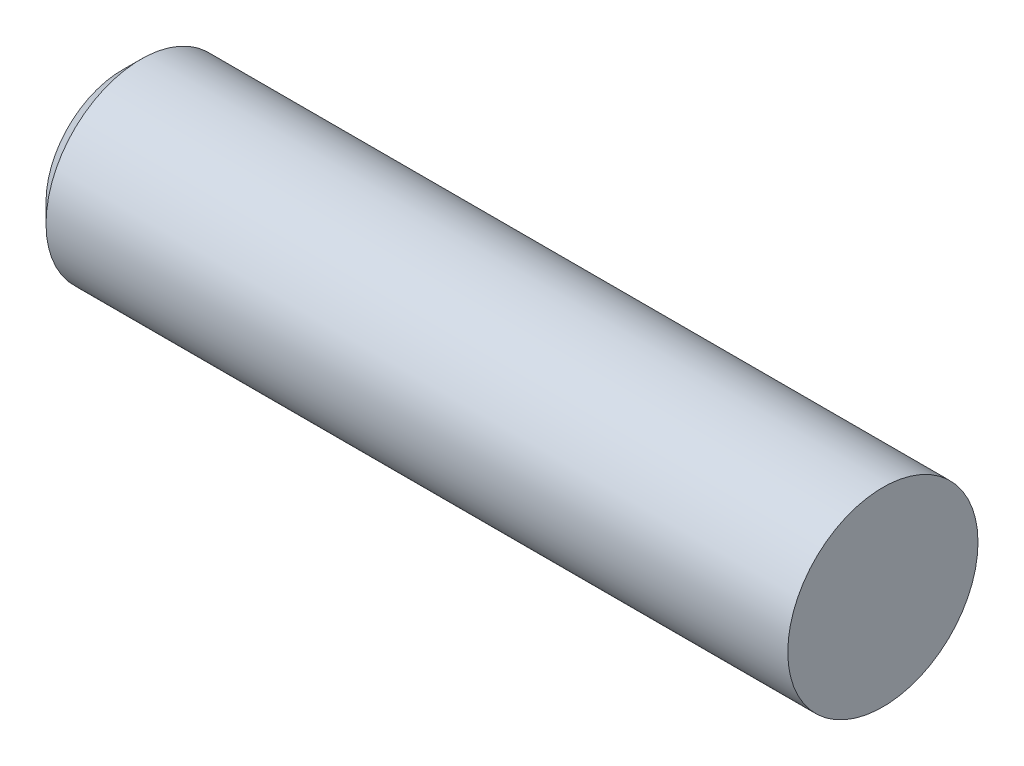
ISO-10303-21;
HEADER;
FILE_DESCRIPTION(('STEP AP214'),'2;1');
FILE_NAME('part.step','',(''),(''),'','','');
FILE_SCHEMA(('AUTOMOTIVE_DESIGN { 1 0 10303 214 1 1 1 1 }'));
ENDSEC;
DATA;
#1=APPLICATION_CONTEXT('core data for automotive mechanical design processes');
#2=APPLICATION_PROTOCOL_DEFINITION('international standard','automotive_design',2000,#1);
#3=PRODUCT_CONTEXT('',#1,'mechanical');
#4=PRODUCT('Part','Part','',(#3));
#5=PRODUCT_RELATED_PRODUCT_CATEGORY('part','',(#4));
#6=PRODUCT_DEFINITION_FORMATION('','',#4);
#7=PRODUCT_DEFINITION_CONTEXT('part definition',#1,'design');
#8=PRODUCT_DEFINITION('design','',#6,#7);
#9=PRODUCT_DEFINITION_SHAPE('','',#8);
#10=(LENGTH_UNIT() NAMED_UNIT(*) SI_UNIT(.MILLI.,.METRE.));
#11=(NAMED_UNIT(*) PLANE_ANGLE_UNIT() SI_UNIT($,.RADIAN.));
#12=(NAMED_UNIT(*) SI_UNIT($,.STERADIAN.) SOLID_ANGLE_UNIT());
#13=UNCERTAINTY_MEASURE_WITH_UNIT(LENGTH_MEASURE(1.E-05),#10,'distance_accuracy_value','');
#14=(GEOMETRIC_REPRESENTATION_CONTEXT(3) GLOBAL_UNCERTAINTY_ASSIGNED_CONTEXT((#13)) GLOBAL_UNIT_ASSIGNED_CONTEXT((#10,
#11,#12)) REPRESENTATION_CONTEXT('',''));
#15=CARTESIAN_POINT('',(0.,0.,0.));
#16=DIRECTION('',(0.,0.,1.));
#17=DIRECTION('',(1.,0.,0.));
#18=AXIS2_PLACEMENT_3D('',#15,#16,#17);
#19=CARTESIAN_POINT('',(-4.7625,0.,0.));
#20=DIRECTION('',(1.,0.,0.));
#21=DIRECTION('',(0.,0.,1.));
#22=AXIS2_PLACEMENT_3D('',#19,#20,#21);
#23=CYLINDRICAL_SURFACE('',#22,1.190625);
#24=CARTESIAN_POINT('',(4.7625,0.,0.));
#25=DIRECTION('',(-1.,0.,0.));
#26=DIRECTION('',(0.,0.,1.));
#27=AXIS2_PLACEMENT_3D('',#24,#25,#26);
#28=CIRCLE('',#27,1.190625);
#29=CARTESIAN_POINT('',(4.7625,0.,1.190625));
#30=VERTEX_POINT('',#29);
#31=EDGE_CURVE('E38',#30,#30,#28,.T.);
#32=ORIENTED_EDGE('',*,*,#31,.T.);
#33=EDGE_LOOP('',(#32));
#34=FACE_BOUND('',#33,.T.);
#35=CARTESIAN_POINT('',(-4.524375,0.,0.));
#36=DIRECTION('',(-1.,0.,0.));
#37=DIRECTION('',(0.,0.,1.));
#38=AXIS2_PLACEMENT_3D('',#35,#36,#37);
#39=CIRCLE('',#38,1.190625);
#40=CARTESIAN_POINT('',(-4.524375,0.,1.190625));
#41=VERTEX_POINT('',#40);
#42=EDGE_CURVE('E42',#41,#41,#39,.T.);
#43=ORIENTED_EDGE('',*,*,#42,.F.);
#44=EDGE_LOOP('',(#43));
#45=FACE_BOUND('',#44,.T.);
#46=ADVANCED_FACE('F35',(#34,#45),#23,.T.);
#47=CARTESIAN_POINT('',(-4.7625,0.,0.));
#48=DIRECTION('',(1.,0.,0.));
#49=DIRECTION('',(0.,0.,1.));
#50=AXIS2_PLACEMENT_3D('',#47,#48,#49);
#51=PLANE('',#50);
#52=CARTESIAN_POINT('',(-4.7625,0.,0.));
#53=DIRECTION('',(-1.,0.,0.));
#54=DIRECTION('',(0.,0.,1.));
#55=AXIS2_PLACEMENT_3D('',#52,#53,#54);
#56=CIRCLE('',#55,0.952499999999998);
#57=CARTESIAN_POINT('',(-4.7625,0.,0.952499999999999));
#58=VERTEX_POINT('',#57);
#59=EDGE_CURVE('E10',#58,#58,#56,.F.);
#60=ORIENTED_EDGE('',*,*,#59,.F.);
#61=EDGE_LOOP('',(#60));
#62=FACE_BOUND('',#61,.T.);
#63=ADVANCED_FACE('F57',(#62),#51,.F.);
#64=CARTESIAN_POINT('',(4.7625,0.,0.));
#65=DIRECTION('',(1.,0.,0.));
#66=DIRECTION('',(0.,0.,1.));
#67=AXIS2_PLACEMENT_3D('',#64,#65,#66);
#68=PLANE('',#67);
#69=ORIENTED_EDGE('',*,*,#31,.F.);
#70=EDGE_LOOP('',(#69));
#71=FACE_BOUND('',#70,.T.);
#72=ADVANCED_FACE('F54',(#71),#68,.T.);
#73=CARTESIAN_POINT('',(-4.524375,0.,0.));
#74=DIRECTION('',(1.,0.,0.));
#75=DIRECTION('',(0.,0.,1.));
#76=AXIS2_PLACEMENT_3D('',#73,#74,#75);
#77=CONICAL_SURFACE('',#76,1.190625,0.78539816339745);
#78=CARTESIAN_POINT('',(-4.7625,0.,0.952499999999999));
#79=CARTESIAN_POINT('',(-4.76001953125,0.,0.954980468749999));
#80=CARTESIAN_POINT('',(-4.7575390625,0.,0.957460937499999));
#81=CARTESIAN_POINT('',(-4.752578125,0.,0.962421874999999));
#82=CARTESIAN_POINT('',(-4.75009765625,0.,0.964902343749999));
#83=CARTESIAN_POINT('',(-4.74513671875,0.,0.969863281249999));
#84=CARTESIAN_POINT('',(-4.74265625,0.,0.972343749999999));
#85=CARTESIAN_POINT('',(-4.7376953125,0.,0.977304687499999));
#86=CARTESIAN_POINT('',(-4.73521484375,0.,0.979785156249999));
#87=CARTESIAN_POINT('',(-4.73025390625,0.,0.984746093749999));
#88=CARTESIAN_POINT('',(-4.7277734375,0.,0.987226562499999));
#89=CARTESIAN_POINT('',(-4.7228125,0.,0.992187499999999));
#90=CARTESIAN_POINT('',(-4.72033203125,0.,0.994667968749999));
#91=CARTESIAN_POINT('',(-4.71537109375,0.,0.999628906249999));
#92=CARTESIAN_POINT('',(-4.712890625,0.,1.002109375));
#93=CARTESIAN_POINT('',(-4.7079296875,0.,1.0070703125));
#94=CARTESIAN_POINT('',(-4.70544921875,0.,1.00955078125));
#95=CARTESIAN_POINT('',(-4.70048828125,0.,1.01451171875));
#96=CARTESIAN_POINT('',(-4.6980078125,0.,1.0169921875));
#97=CARTESIAN_POINT('',(-4.693046875,0.,1.021953125));
#98=CARTESIAN_POINT('',(-4.69056640625,0.,1.02443359375));
#99=CARTESIAN_POINT('',(-4.68560546875,0.,1.02939453125));
#100=CARTESIAN_POINT('',(-4.683125,0.,1.031875));
#101=CARTESIAN_POINT('',(-4.6781640625,0.,1.0368359375));
#102=CARTESIAN_POINT('',(-4.67568359375,0.,1.03931640625));
#103=CARTESIAN_POINT('',(-4.67072265625,0.,1.04427734375));
#104=CARTESIAN_POINT('',(-4.6682421875,0.,1.0467578125));
#105=CARTESIAN_POINT('',(-4.66328125,0.,1.05171875));
#106=CARTESIAN_POINT('',(-4.66080078125,0.,1.05419921875));
#107=CARTESIAN_POINT('',(-4.65583984375,0.,1.05916015625));
#108=CARTESIAN_POINT('',(-4.653359375,0.,1.061640625));
#109=CARTESIAN_POINT('',(-4.6483984375,0.,1.0666015625));
#110=CARTESIAN_POINT('',(-4.64591796875,0.,1.06908203125));
#111=CARTESIAN_POINT('',(-4.64095703125,0.,1.07404296875));
#112=CARTESIAN_POINT('',(-4.6384765625,0.,1.0765234375));
#113=CARTESIAN_POINT('',(-4.633515625,0.,1.081484375));
#114=CARTESIAN_POINT('',(-4.63103515625,0.,1.08396484375));
#115=CARTESIAN_POINT('',(-4.62607421875,0.,1.08892578125));
#116=CARTESIAN_POINT('',(-4.62359375,0.,1.09140625));
#117=CARTESIAN_POINT('',(-4.6186328125,0.,1.0963671875));
#118=CARTESIAN_POINT('',(-4.61615234375,0.,1.09884765625));
#119=CARTESIAN_POINT('',(-4.61119140625,0.,1.10380859375));
#120=CARTESIAN_POINT('',(-4.6087109375,0.,1.1062890625));
#121=CARTESIAN_POINT('',(-4.60375,0.,1.11125));
#122=CARTESIAN_POINT('',(-4.60126953125,0.,1.11373046875));
#123=CARTESIAN_POINT('',(-4.59630859375,0.,1.11869140625));
#124=CARTESIAN_POINT('',(-4.593828125,0.,1.121171875));
#125=CARTESIAN_POINT('',(-4.5888671875,0.,1.1261328125));
#126=CARTESIAN_POINT('',(-4.58638671875,0.,1.12861328125));
#127=CARTESIAN_POINT('',(-4.58142578125,0.,1.13357421875));
#128=CARTESIAN_POINT('',(-4.5789453125,0.,1.1360546875));
#129=CARTESIAN_POINT('',(-4.573984375,0.,1.141015625));
#130=CARTESIAN_POINT('',(-4.57150390625,0.,1.14349609375));
#131=CARTESIAN_POINT('',(-4.56654296875,0.,1.14845703125));
#132=CARTESIAN_POINT('',(-4.5640625,0.,1.1509375));
#133=CARTESIAN_POINT('',(-4.5591015625,0.,1.1558984375));
#134=CARTESIAN_POINT('',(-4.55662109375,0.,1.15837890625));
#135=CARTESIAN_POINT('',(-4.55166015625,0.,1.16333984375));
#136=CARTESIAN_POINT('',(-4.5491796875,0.,1.1658203125));
#137=CARTESIAN_POINT('',(-4.54421875,0.,1.17078125));
#138=CARTESIAN_POINT('',(-4.54173828125,0.,1.17326171875));
#139=CARTESIAN_POINT('',(-4.53677734375,0.,1.17822265625));
#140=CARTESIAN_POINT('',(-4.534296875,0.,1.180703125));
#141=CARTESIAN_POINT('',(-4.5293359375,0.,1.1856640625));
#142=CARTESIAN_POINT('',(-4.52685546875,0.,1.18814453125));
#143=CARTESIAN_POINT('',(-4.524375,0.,1.190625));
#144=B_SPLINE_CURVE_WITH_KNOTS('',3,(#78,#79,#80,#81,#82,#83,#84,#85,#86,#87,#88,#89,#90,#91,
#92,#93,#94,#95,#96,#97,#98,#99,#100,#101,#102,#103,#104,#105,#106,#107,#108,#109,#110,#111,
#112,#113,#114,#115,#116,#117,#118,#119,#120,#121,#122,#123,#124,#125,#126,#127,#128,#129,#130,
#131,#132,#133,#134,#135,#136,#137,#138,#139,#140,#141,#142,#143),.UNSPECIFIED.,.F.,.F.,(4,2,2,
2,2,2,2,2,2,2,2,2,2,2,2,2,2,2,2,2,2,2,2,2,2,2,2,2,2,2,2,2,4),(0.,0.0105237376418775,
0.0210474752837556,0.0315712129256336,0.0420949505675117,0.0526186882093898,0.0631424258512672,
0.0736661634931453,0.0841899011350233,0.0947136387769013,0.10523737641878,0.115761114060657,
0.126284851702535,0.136808589344413,0.147332326986291,0.157856064628169,0.168379802270047,
0.178903539911925,0.189427277553803,0.199951015195681,0.210474752837559,0.220998490479437,
0.231522228121314,0.242045965763193,0.252569703405071,0.263093441046949,0.273617178688827,
0.284140916330704,0.294664653972582,0.30518839161446,0.315712129256338,0.326235866898216,
0.336759604540094),.UNSPECIFIED.);
#145=EDGE_CURVE('BSEAM56',#58,#41,#144,.T.);
#146=ORIENTED_EDGE('',*,*,#59,.T.);
#147=ORIENTED_EDGE('',*,*,#42,.T.);
#148=ORIENTED_EDGE('',*,*,#145,.T.);
#149=ORIENTED_EDGE('',*,*,#145,.F.);
#150=EDGE_LOOP('',(#146,#148,#147,#149));
#151=FACE_BOUND('',#150,.T.);
#152=ADVANCED_FACE('F56',(#151),#77,.T.);
#153=CLOSED_SHELL('',(#46,#63,#72,#152));
#154=MANIFOLD_SOLID_BREP('B2',#153);
#155=ADVANCED_BREP_SHAPE_REPRESENTATION('',(#18,#154),#14);
#156=SHAPE_DEFINITION_REPRESENTATION(#9,#155);
ENDSEC;
END-ISO-10303-21;
